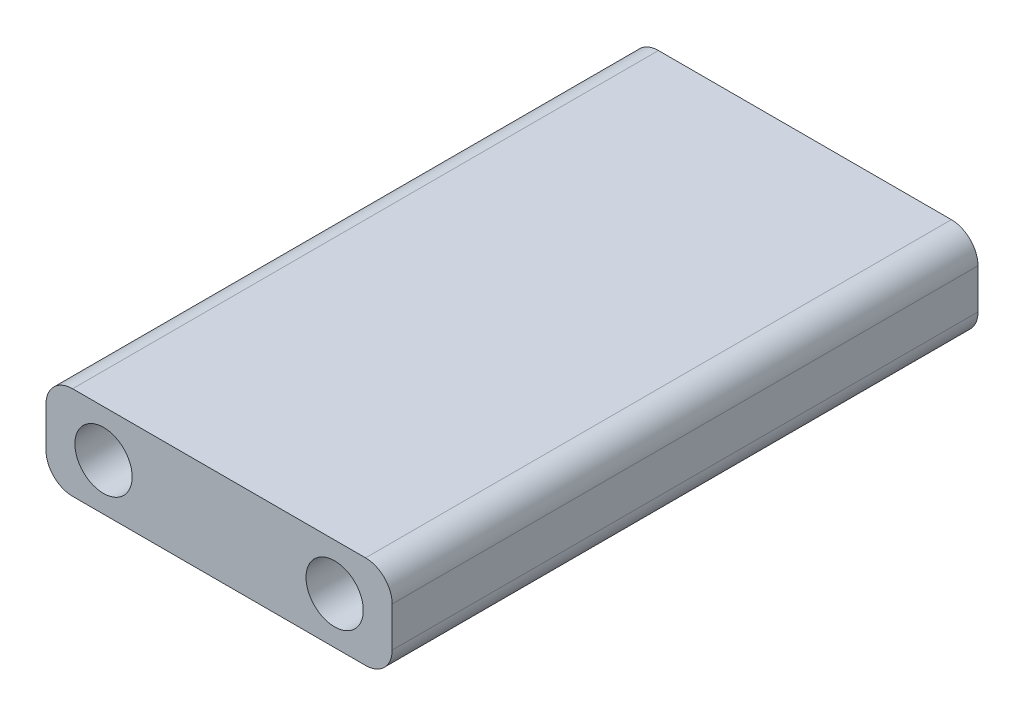
ISO-10303-21;
HEADER;
FILE_DESCRIPTION(('STEP AP214'),'2;1');
FILE_NAME('part.step','',(''),(''),'','','');
FILE_SCHEMA(('AUTOMOTIVE_DESIGN { 1 0 10303 214 1 1 1 1 }'));
ENDSEC;
DATA;
#1=APPLICATION_CONTEXT('core data for automotive mechanical design processes');
#2=APPLICATION_PROTOCOL_DEFINITION('international standard','automotive_design',2000,#1);
#3=PRODUCT_CONTEXT('',#1,'mechanical');
#4=PRODUCT('Part','Part','',(#3));
#5=PRODUCT_RELATED_PRODUCT_CATEGORY('part','',(#4));
#6=PRODUCT_DEFINITION_FORMATION('','',#4);
#7=PRODUCT_DEFINITION_CONTEXT('part definition',#1,'design');
#8=PRODUCT_DEFINITION('design','',#6,#7);
#9=PRODUCT_DEFINITION_SHAPE('','',#8);
#10=(LENGTH_UNIT() NAMED_UNIT(*) SI_UNIT(.MILLI.,.METRE.));
#11=(NAMED_UNIT(*) PLANE_ANGLE_UNIT() SI_UNIT($,.RADIAN.));
#12=(NAMED_UNIT(*) SI_UNIT($,.STERADIAN.) SOLID_ANGLE_UNIT());
#13=UNCERTAINTY_MEASURE_WITH_UNIT(LENGTH_MEASURE(1.E-05),#10,'distance_accuracy_value','');
#14=(GEOMETRIC_REPRESENTATION_CONTEXT(3) GLOBAL_UNCERTAINTY_ASSIGNED_CONTEXT((#13)) GLOBAL_UNIT_ASSIGNED_CONTEXT((#10,
#11,#12)) REPRESENTATION_CONTEXT('',''));
#15=CARTESIAN_POINT('',(0.,0.,0.));
#16=DIRECTION('',(0.,0.,1.));
#17=DIRECTION('',(1.,0.,0.));
#18=AXIS2_PLACEMENT_3D('',#15,#16,#17);
#19=CARTESIAN_POINT('',(13.,7.,-22.));
#20=DIRECTION('',(-1.,0.,0.));
#21=DIRECTION('',(0.,0.,1.));
#22=AXIS2_PLACEMENT_3D('',#19,#20,#21);
#23=PLANE('',#22);
#24=DIRECTION('',(0.,-1.,0.));
#25=VECTOR('',#24,1.);
#26=CARTESIAN_POINT('',(13.,7.,22.));
#27=LINE('',#26,#25);
#28=CARTESIAN_POINT('',(13.,5.,22.));
#29=VERTEX_POINT('',#28);
#30=CARTESIAN_POINT('',(13.,2.,22.));
#31=VERTEX_POINT('',#30);
#32=EDGE_CURVE('E154',#29,#31,#27,.T.);
#33=ORIENTED_EDGE('',*,*,#32,.T.);
#34=DIRECTION('',(0.,0.,-1.));
#35=VECTOR('',#34,1.);
#36=CARTESIAN_POINT('',(13.,2.,-22.));
#37=LINE('',#36,#35);
#38=CARTESIAN_POINT('',(13.,2.,-22.));
#39=VERTEX_POINT('',#38);
#40=EDGE_CURVE('E118',#31,#39,#37,.T.);
#41=ORIENTED_EDGE('',*,*,#40,.T.);
#42=DIRECTION('',(0.,-1.,0.));
#43=VECTOR('',#42,1.);
#44=CARTESIAN_POINT('',(13.,7.,-22.));
#45=LINE('',#44,#43);
#46=CARTESIAN_POINT('',(13.,5.,-22.));
#47=VERTEX_POINT('',#46);
#48=EDGE_CURVE('E103',#47,#39,#45,.T.);
#49=ORIENTED_EDGE('',*,*,#48,.F.);
#50=DIRECTION('',(0.,0.,-1.));
#51=VECTOR('',#50,1.);
#52=CARTESIAN_POINT('',(13.,5.,22.));
#53=LINE('',#52,#51);
#54=EDGE_CURVE('E115',#47,#29,#53,.F.);
#55=ORIENTED_EDGE('',*,*,#54,.T.);
#56=EDGE_LOOP('',(#33,#41,#49,#55));
#57=FACE_BOUND('',#56,.T.);
#58=ADVANCED_FACE('F33',(#57),#23,.F.);
#59=CARTESIAN_POINT('',(-13.,7.,-22.));
#60=DIRECTION('',(0.,0.,1.));
#61=DIRECTION('',(1.,0.,0.));
#62=AXIS2_PLACEMENT_3D('',#59,#60,#61);
#63=PLANE('',#62);
#64=CARTESIAN_POINT('',(-8.68,3.5,-22.));
#65=DIRECTION('',(0.,0.,1.));
#66=DIRECTION('',(1.,0.,0.));
#67=AXIS2_PLACEMENT_3D('',#64,#65,#66);
#68=CIRCLE('',#67,2.15);
#69=CARTESIAN_POINT('',(-6.53,3.5,-22.));
#70=VERTEX_POINT('',#69);
#71=EDGE_CURVE('E355',#70,#70,#68,.T.);
#72=ORIENTED_EDGE('',*,*,#71,.T.);
#73=EDGE_LOOP('',(#72));
#74=FACE_BOUND('',#73,.T.);
#75=CARTESIAN_POINT('',(8.68,3.5,-22.));
#76=DIRECTION('',(0.,0.,1.));
#77=DIRECTION('',(-1.,0.,0.));
#78=AXIS2_PLACEMENT_3D('',#75,#76,#77);
#79=CIRCLE('',#78,2.15);
#80=CARTESIAN_POINT('',(6.53,3.5,-22.));
#81=VERTEX_POINT('',#80);
#82=EDGE_CURVE('E361',#81,#81,#79,.T.);
#83=ORIENTED_EDGE('',*,*,#82,.T.);
#84=EDGE_LOOP('',(#83));
#85=FACE_BOUND('',#84,.T.);
#86=ORIENTED_EDGE('',*,*,#48,.T.);
#87=CARTESIAN_POINT('',(11.,2.,-22.));
#88=DIRECTION('',(0.,0.,1.));
#89=DIRECTION('',(1.,0.,0.));
#90=AXIS2_PLACEMENT_3D('',#87,#88,#89);
#91=CIRCLE('',#90,2.);
#92=CARTESIAN_POINT('',(11.,0.,-22.));
#93=VERTEX_POINT('',#92);
#94=EDGE_CURVE('E130',#39,#93,#91,.F.);
#95=ORIENTED_EDGE('',*,*,#94,.T.);
#96=DIRECTION('',(-1.,0.,0.));
#97=VECTOR('',#96,1.);
#98=CARTESIAN_POINT('',(-13.,0.,-22.));
#99=LINE('',#98,#97);
#100=CARTESIAN_POINT('',(-11.,0.,-22.));
#101=VERTEX_POINT('',#100);
#102=EDGE_CURVE('E162',#93,#101,#99,.T.);
#103=ORIENTED_EDGE('',*,*,#102,.T.);
#104=CARTESIAN_POINT('',(-11.,2.,-22.));
#105=DIRECTION('',(0.,0.,1.));
#106=DIRECTION('',(1.,0.,0.));
#107=AXIS2_PLACEMENT_3D('',#104,#105,#106);
#108=CIRCLE('',#107,2.);
#109=CARTESIAN_POINT('',(-13.,2.,-22.));
#110=VERTEX_POINT('',#109);
#111=EDGE_CURVE('E109',#101,#110,#108,.F.);
#112=ORIENTED_EDGE('',*,*,#111,.T.);
#113=DIRECTION('',(0.,-1.,0.));
#114=VECTOR('',#113,1.);
#115=CARTESIAN_POINT('',(-13.,7.,-22.));
#116=LINE('',#115,#114);
#117=CARTESIAN_POINT('',(-13.,5.,-22.));
#118=VERTEX_POINT('',#117);
#119=EDGE_CURVE('E119',#118,#110,#116,.T.);
#120=ORIENTED_EDGE('',*,*,#119,.F.);
#121=CARTESIAN_POINT('',(-11.,5.,-22.));
#122=DIRECTION('',(0.,0.,1.));
#123=DIRECTION('',(1.,0.,0.));
#124=AXIS2_PLACEMENT_3D('',#121,#122,#123);
#125=CIRCLE('',#124,2.);
#126=CARTESIAN_POINT('',(-11.,7.,-22.));
#127=VERTEX_POINT('',#126);
#128=EDGE_CURVE('E110',#118,#127,#125,.F.);
#129=ORIENTED_EDGE('',*,*,#128,.T.);
#130=DIRECTION('',(-1.,0.,0.));
#131=VECTOR('',#130,1.);
#132=CARTESIAN_POINT('',(-13.,7.,-22.));
#133=LINE('',#132,#131);
#134=CARTESIAN_POINT('',(11.,7.,-22.));
#135=VERTEX_POINT('',#134);
#136=EDGE_CURVE('E105',#135,#127,#133,.T.);
#137=ORIENTED_EDGE('',*,*,#136,.F.);
#138=CARTESIAN_POINT('',(11.,5.,-22.));
#139=DIRECTION('',(0.,0.,1.));
#140=DIRECTION('',(1.,0.,0.));
#141=AXIS2_PLACEMENT_3D('',#138,#139,#140);
#142=CIRCLE('',#141,2.);
#143=EDGE_CURVE('E100',#135,#47,#142,.F.);
#144=ORIENTED_EDGE('',*,*,#143,.T.);
#145=EDGE_LOOP('',(#86,#95,#103,#112,#120,#129,#137,#144));
#146=FACE_BOUND('',#145,.T.);
#147=ADVANCED_FACE('F102',(#74,#85,#146),#63,.F.);
#148=CARTESIAN_POINT('',(-13.,7.,-22.));
#149=DIRECTION('',(1.,0.,0.));
#150=DIRECTION('',(0.,0.,-1.));
#151=AXIS2_PLACEMENT_3D('',#148,#149,#150);
#152=PLANE('',#151);
#153=ORIENTED_EDGE('',*,*,#119,.T.);
#154=DIRECTION('',(0.,0.,1.));
#155=VECTOR('',#154,1.);
#156=CARTESIAN_POINT('',(-13.,2.,-22.));
#157=LINE('',#156,#155);
#158=CARTESIAN_POINT('',(-13.,2.,22.));
#159=VERTEX_POINT('',#158);
#160=EDGE_CURVE('E143',#110,#159,#157,.T.);
#161=ORIENTED_EDGE('',*,*,#160,.T.);
#162=DIRECTION('',(0.,-1.,0.));
#163=VECTOR('',#162,1.);
#164=CARTESIAN_POINT('',(-13.,7.,22.));
#165=LINE('',#164,#163);
#166=CARTESIAN_POINT('',(-13.,5.,22.));
#167=VERTEX_POINT('',#166);
#168=EDGE_CURVE('E156',#167,#159,#165,.T.);
#169=ORIENTED_EDGE('',*,*,#168,.F.);
#170=DIRECTION('',(0.,0.,1.));
#171=VECTOR('',#170,1.);
#172=CARTESIAN_POINT('',(-13.,5.,-22.));
#173=LINE('',#172,#171);
#174=EDGE_CURVE('E141',#167,#118,#173,.F.);
#175=ORIENTED_EDGE('',*,*,#174,.T.);
#176=EDGE_LOOP('',(#153,#161,#169,#175));
#177=FACE_BOUND('',#176,.T.);
#178=ADVANCED_FACE('F170',(#177),#152,.F.);
#179=CARTESIAN_POINT('',(-13.,7.,22.));
#180=DIRECTION('',(0.,0.,-1.));
#181=DIRECTION('',(-1.,0.,0.));
#182=AXIS2_PLACEMENT_3D('',#179,#180,#181);
#183=PLANE('',#182);
#184=CARTESIAN_POINT('',(-8.68,3.5,22.));
#185=DIRECTION('',(0.,0.,1.));
#186=DIRECTION('',(1.,0.,0.));
#187=AXIS2_PLACEMENT_3D('',#184,#185,#186);
#188=CIRCLE('',#187,2.15);
#189=CARTESIAN_POINT('',(-6.53,3.5,22.));
#190=VERTEX_POINT('',#189);
#191=EDGE_CURVE('E345',#190,#190,#188,.T.);
#192=ORIENTED_EDGE('',*,*,#191,.F.);
#193=EDGE_LOOP('',(#192));
#194=FACE_BOUND('',#193,.T.);
#195=CARTESIAN_POINT('',(8.68,3.5,22.));
#196=DIRECTION('',(0.,0.,1.));
#197=DIRECTION('',(-1.,0.,0.));
#198=AXIS2_PLACEMENT_3D('',#195,#196,#197);
#199=CIRCLE('',#198,2.15);
#200=CARTESIAN_POINT('',(6.53,3.5,22.));
#201=VERTEX_POINT('',#200);
#202=EDGE_CURVE('E348',#201,#201,#199,.T.);
#203=ORIENTED_EDGE('',*,*,#202,.F.);
#204=EDGE_LOOP('',(#203));
#205=FACE_BOUND('',#204,.T.);
#206=DIRECTION('',(1.,0.,0.));
#207=VECTOR('',#206,1.);
#208=CARTESIAN_POINT('',(-13.,0.,22.));
#209=LINE('',#208,#207);
#210=CARTESIAN_POINT('',(-11.,0.,22.));
#211=VERTEX_POINT('',#210);
#212=CARTESIAN_POINT('',(11.,0.,22.));
#213=VERTEX_POINT('',#212);
#214=EDGE_CURVE('E158',#211,#213,#209,.T.);
#215=ORIENTED_EDGE('',*,*,#214,.T.);
#216=CARTESIAN_POINT('',(11.,2.,22.));
#217=DIRECTION('',(0.,0.,-1.));
#218=DIRECTION('',(-1.,0.,0.));
#219=AXIS2_PLACEMENT_3D('',#216,#217,#218);
#220=CIRCLE('',#219,2.);
#221=EDGE_CURVE('E139',#213,#31,#220,.F.);
#222=ORIENTED_EDGE('',*,*,#221,.T.);
#223=ORIENTED_EDGE('',*,*,#32,.F.);
#224=CARTESIAN_POINT('',(11.,5.,22.));
#225=DIRECTION('',(0.,0.,-1.));
#226=DIRECTION('',(-1.,0.,0.));
#227=AXIS2_PLACEMENT_3D('',#224,#225,#226);
#228=CIRCLE('',#227,2.);
#229=CARTESIAN_POINT('',(11.,7.,22.));
#230=VERTEX_POINT('',#229);
#231=EDGE_CURVE('E123',#29,#230,#228,.F.);
#232=ORIENTED_EDGE('',*,*,#231,.T.);
#233=DIRECTION('',(1.,0.,0.));
#234=VECTOR('',#233,1.);
#235=CARTESIAN_POINT('',(-13.,7.,22.));
#236=LINE('',#235,#234);
#237=CARTESIAN_POINT('',(-11.,7.,22.));
#238=VERTEX_POINT('',#237);
#239=EDGE_CURVE('E149',#238,#230,#236,.T.);
#240=ORIENTED_EDGE('',*,*,#239,.F.);
#241=CARTESIAN_POINT('',(-11.,5.,22.));
#242=DIRECTION('',(0.,0.,-1.));
#243=DIRECTION('',(-1.,0.,0.));
#244=AXIS2_PLACEMENT_3D('',#241,#242,#243);
#245=CIRCLE('',#244,2.);
#246=EDGE_CURVE('E56',#238,#167,#245,.F.);
#247=ORIENTED_EDGE('',*,*,#246,.T.);
#248=ORIENTED_EDGE('',*,*,#168,.T.);
#249=CARTESIAN_POINT('',(-11.,2.,22.));
#250=DIRECTION('',(0.,0.,-1.));
#251=DIRECTION('',(-1.,0.,0.));
#252=AXIS2_PLACEMENT_3D('',#249,#250,#251);
#253=CIRCLE('',#252,2.);
#254=EDGE_CURVE('E48',#159,#211,#253,.F.);
#255=ORIENTED_EDGE('',*,*,#254,.T.);
#256=EDGE_LOOP('',(#215,#222,#223,#232,#240,#247,#248,#255));
#257=FACE_BOUND('',#256,.T.);
#258=ADVANCED_FACE('F153',(#194,#205,#257),#183,.F.);
#259=CARTESIAN_POINT('',(0.,7.,0.));
#260=DIRECTION('',(0.,1.,0.));
#261=DIRECTION('',(0.,0.,1.));
#262=AXIS2_PLACEMENT_3D('',#259,#260,#261);
#263=PLANE('',#262);
#264=ORIENTED_EDGE('',*,*,#239,.T.);
#265=DIRECTION('',(0.,0.,-1.));
#266=VECTOR('',#265,1.);
#267=CARTESIAN_POINT('',(11.,7.,-22.));
#268=LINE('',#267,#266);
#269=EDGE_CURVE('E11',#230,#135,#268,.T.);
#270=ORIENTED_EDGE('',*,*,#269,.T.);
#271=ORIENTED_EDGE('',*,*,#136,.T.);
#272=DIRECTION('',(0.,0.,1.));
#273=VECTOR('',#272,1.);
#274=CARTESIAN_POINT('',(-11.,7.,22.));
#275=LINE('',#274,#273);
#276=EDGE_CURVE('E41',#127,#238,#275,.T.);
#277=ORIENTED_EDGE('',*,*,#276,.T.);
#278=EDGE_LOOP('',(#264,#270,#271,#277));
#279=FACE_BOUND('',#278,.T.);
#280=ADVANCED_FACE('F148',(#279),#263,.T.);
#281=CARTESIAN_POINT('',(0.,0.,0.));
#282=DIRECTION('',(0.,1.,0.));
#283=DIRECTION('',(0.,0.,1.));
#284=AXIS2_PLACEMENT_3D('',#281,#282,#283);
#285=PLANE('',#284);
#286=ORIENTED_EDGE('',*,*,#102,.F.);
#287=DIRECTION('',(0.,0.,-1.));
#288=VECTOR('',#287,1.);
#289=CARTESIAN_POINT('',(11.,0.,0.));
#290=LINE('',#289,#288);
#291=EDGE_CURVE('E134',#93,#213,#290,.F.);
#292=ORIENTED_EDGE('',*,*,#291,.T.);
#293=ORIENTED_EDGE('',*,*,#214,.F.);
#294=DIRECTION('',(0.,0.,1.));
#295=VECTOR('',#294,1.);
#296=CARTESIAN_POINT('',(-11.,0.,0.));
#297=LINE('',#296,#295);
#298=EDGE_CURVE('E132',#211,#101,#297,.F.);
#299=ORIENTED_EDGE('',*,*,#298,.T.);
#300=EDGE_LOOP('',(#286,#292,#293,#299));
#301=FACE_BOUND('',#300,.T.);
#302=ADVANCED_FACE('F177',(#301),#285,.F.);
#303=CARTESIAN_POINT('',(8.68,3.5,17.));
#304=DIRECTION('',(0.,0.,1.));
#305=DIRECTION('',(1.,0.,0.));
#306=AXIS2_PLACEMENT_3D('',#303,#304,#305);
#307=CYLINDRICAL_SURFACE('',#306,2.15);
#308=CARTESIAN_POINT('',(8.68,3.5,17.));
#309=DIRECTION('',(0.,0.,1.));
#310=DIRECTION('',(-1.,0.,0.));
#311=AXIS2_PLACEMENT_3D('',#308,#309,#310);
#312=CIRCLE('',#311,2.15);
#313=CARTESIAN_POINT('',(6.53,3.5,17.));
#314=VERTEX_POINT('',#313);
#315=EDGE_CURVE('E350',#314,#314,#312,.T.);
#316=ORIENTED_EDGE('',*,*,#315,.F.);
#317=EDGE_LOOP('',(#316));
#318=FACE_BOUND('',#317,.T.);
#319=ORIENTED_EDGE('',*,*,#202,.T.);
#320=EDGE_LOOP('',(#319));
#321=FACE_BOUND('',#320,.T.);
#322=ADVANCED_FACE('F282',(#318,#321),#307,.F.);
#323=CARTESIAN_POINT('',(8.68,3.5,17.));
#324=DIRECTION('',(0.,0.,-1.));
#325=DIRECTION('',(-1.,0.,0.));
#326=AXIS2_PLACEMENT_3D('',#323,#324,#325);
#327=PLANE('',#326);
#328=ORIENTED_EDGE('',*,*,#315,.T.);
#329=EDGE_LOOP('',(#328));
#330=FACE_BOUND('',#329,.T.);
#331=ADVANCED_FACE('F273',(#330),#327,.F.);
#332=CARTESIAN_POINT('',(-8.68,3.5,17.));
#333=DIRECTION('',(0.,0.,1.));
#334=DIRECTION('',(1.,0.,0.));
#335=AXIS2_PLACEMENT_3D('',#332,#333,#334);
#336=CYLINDRICAL_SURFACE('',#335,2.15);
#337=CARTESIAN_POINT('',(-8.68,3.5,17.));
#338=DIRECTION('',(0.,0.,1.));
#339=DIRECTION('',(1.,0.,0.));
#340=AXIS2_PLACEMENT_3D('',#337,#338,#339);
#341=CIRCLE('',#340,2.15);
#342=CARTESIAN_POINT('',(-6.53,3.5,17.));
#343=VERTEX_POINT('',#342);
#344=EDGE_CURVE('E165',#343,#343,#341,.T.);
#345=ORIENTED_EDGE('',*,*,#344,.F.);
#346=EDGE_LOOP('',(#345));
#347=FACE_BOUND('',#346,.T.);
#348=ORIENTED_EDGE('',*,*,#191,.T.);
#349=EDGE_LOOP('',(#348));
#350=FACE_BOUND('',#349,.T.);
#351=ADVANCED_FACE('F264',(#347,#350),#336,.F.);
#352=CARTESIAN_POINT('',(-8.68,3.5,17.));
#353=DIRECTION('',(0.,0.,1.));
#354=DIRECTION('',(1.,0.,0.));
#355=AXIS2_PLACEMENT_3D('',#352,#353,#354);
#356=PLANE('',#355);
#357=ORIENTED_EDGE('',*,*,#344,.T.);
#358=EDGE_LOOP('',(#357));
#359=FACE_BOUND('',#358,.T.);
#360=ADVANCED_FACE('F255',(#359),#356,.T.);
#361=CARTESIAN_POINT('',(8.68,3.5,-17.));
#362=DIRECTION('',(0.,0.,-1.));
#363=DIRECTION('',(-1.,0.,0.));
#364=AXIS2_PLACEMENT_3D('',#361,#362,#363);
#365=CYLINDRICAL_SURFACE('',#364,2.15);
#366=CARTESIAN_POINT('',(8.68,3.5,-17.));
#367=DIRECTION('',(0.,0.,1.));
#368=DIRECTION('',(-1.,0.,0.));
#369=AXIS2_PLACEMENT_3D('',#366,#367,#368);
#370=CIRCLE('',#369,2.15);
#371=CARTESIAN_POINT('',(6.53,3.5,-17.));
#372=VERTEX_POINT('',#371);
#373=EDGE_CURVE('E364',#372,#372,#370,.T.);
#374=ORIENTED_EDGE('',*,*,#373,.T.);
#375=EDGE_LOOP('',(#374));
#376=FACE_BOUND('',#375,.T.);
#377=ORIENTED_EDGE('',*,*,#82,.F.);
#378=EDGE_LOOP('',(#377));
#379=FACE_BOUND('',#378,.T.);
#380=ADVANCED_FACE('F246',(#376,#379),#365,.F.);
#381=CARTESIAN_POINT('',(8.68,3.5,-17.));
#382=DIRECTION('',(0.,0.,1.));
#383=DIRECTION('',(-1.,0.,0.));
#384=AXIS2_PLACEMENT_3D('',#381,#382,#383);
#385=PLANE('',#384);
#386=ORIENTED_EDGE('',*,*,#373,.F.);
#387=EDGE_LOOP('',(#386));
#388=FACE_BOUND('',#387,.T.);
#389=ADVANCED_FACE('F237',(#388),#385,.F.);
#390=CARTESIAN_POINT('',(-8.68,3.5,-17.));
#391=DIRECTION('',(0.,0.,-1.));
#392=DIRECTION('',(-1.,0.,0.));
#393=AXIS2_PLACEMENT_3D('',#390,#391,#392);
#394=CYLINDRICAL_SURFACE('',#393,2.15);
#395=CARTESIAN_POINT('',(-8.68,3.5,-17.));
#396=DIRECTION('',(0.,0.,1.));
#397=DIRECTION('',(1.,0.,0.));
#398=AXIS2_PLACEMENT_3D('',#395,#396,#397);
#399=CIRCLE('',#398,2.15);
#400=CARTESIAN_POINT('',(-6.53,3.5,-17.));
#401=VERTEX_POINT('',#400);
#402=EDGE_CURVE('E351',#401,#401,#399,.T.);
#403=ORIENTED_EDGE('',*,*,#402,.T.);
#404=EDGE_LOOP('',(#403));
#405=FACE_BOUND('',#404,.T.);
#406=ORIENTED_EDGE('',*,*,#71,.F.);
#407=EDGE_LOOP('',(#406));
#408=FACE_BOUND('',#407,.T.);
#409=ADVANCED_FACE('F228',(#405,#408),#394,.F.);
#410=CARTESIAN_POINT('',(-8.68,3.5,-17.));
#411=DIRECTION('',(0.,0.,-1.));
#412=DIRECTION('',(1.,0.,0.));
#413=AXIS2_PLACEMENT_3D('',#410,#411,#412);
#414=PLANE('',#413);
#415=ORIENTED_EDGE('',*,*,#402,.F.);
#416=EDGE_LOOP('',(#415));
#417=FACE_BOUND('',#416,.T.);
#418=ADVANCED_FACE('F197',(#417),#414,.T.);
#419=CARTESIAN_POINT('',(11.,2.,-22.));
#420=DIRECTION('',(0.,0.,-1.));
#421=DIRECTION('',(-1.,0.,0.));
#422=AXIS2_PLACEMENT_3D('',#419,#420,#421);
#423=CYLINDRICAL_SURFACE('',#422,2.);
#424=ORIENTED_EDGE('',*,*,#221,.F.);
#425=ORIENTED_EDGE('',*,*,#291,.F.);
#426=ORIENTED_EDGE('',*,*,#94,.F.);
#427=ORIENTED_EDGE('',*,*,#40,.F.);
#428=EDGE_LOOP('',(#424,#425,#426,#427));
#429=FACE_BOUND('',#428,.T.);
#430=ADVANCED_FACE('F181',(#429),#423,.T.);
#431=CARTESIAN_POINT('',(-11.,2.,-22.));
#432=DIRECTION('',(0.,0.,1.));
#433=DIRECTION('',(1.,0.,0.));
#434=AXIS2_PLACEMENT_3D('',#431,#432,#433);
#435=CYLINDRICAL_SURFACE('',#434,2.);
#436=ORIENTED_EDGE('',*,*,#111,.F.);
#437=ORIENTED_EDGE('',*,*,#298,.F.);
#438=ORIENTED_EDGE('',*,*,#254,.F.);
#439=ORIENTED_EDGE('',*,*,#160,.F.);
#440=EDGE_LOOP('',(#436,#437,#438,#439));
#441=FACE_BOUND('',#440,.T.);
#442=ADVANCED_FACE('F173',(#441),#435,.T.);
#443=CARTESIAN_POINT('',(11.,5.,0.));
#444=DIRECTION('',(0.,0.,1.));
#445=DIRECTION('',(1.,0.,0.));
#446=AXIS2_PLACEMENT_3D('',#443,#444,#445);
#447=CYLINDRICAL_SURFACE('',#446,2.);
#448=ORIENTED_EDGE('',*,*,#231,.F.);
#449=ORIENTED_EDGE('',*,*,#54,.F.);
#450=ORIENTED_EDGE('',*,*,#143,.F.);
#451=ORIENTED_EDGE('',*,*,#269,.F.);
#452=EDGE_LOOP('',(#448,#449,#450,#451));
#453=FACE_BOUND('',#452,.T.);
#454=ADVANCED_FACE('F122',(#453),#447,.T.);
#455=CARTESIAN_POINT('',(-11.,5.,0.));
#456=DIRECTION('',(0.,0.,-1.));
#457=DIRECTION('',(-1.,0.,0.));
#458=AXIS2_PLACEMENT_3D('',#455,#456,#457);
#459=CYLINDRICAL_SURFACE('',#458,2.);
#460=ORIENTED_EDGE('',*,*,#128,.F.);
#461=ORIENTED_EDGE('',*,*,#174,.F.);
#462=ORIENTED_EDGE('',*,*,#246,.F.);
#463=ORIENTED_EDGE('',*,*,#276,.F.);
#464=EDGE_LOOP('',(#460,#461,#462,#463));
#465=FACE_BOUND('',#464,.T.);
#466=ADVANCED_FACE('F35',(#465),#459,.T.);
#467=CLOSED_SHELL('',(#58,#147,#178,#258,#280,#302,#322,#331,#351,#360,#380,#389,#409,#418,#430,
#442,#454,#466));
#468=MANIFOLD_SOLID_BREP('B2',#467);
#469=ADVANCED_BREP_SHAPE_REPRESENTATION('',(#18,#468),#14);
#470=SHAPE_DEFINITION_REPRESENTATION(#9,#469);
ENDSEC;
END-ISO-10303-21;
